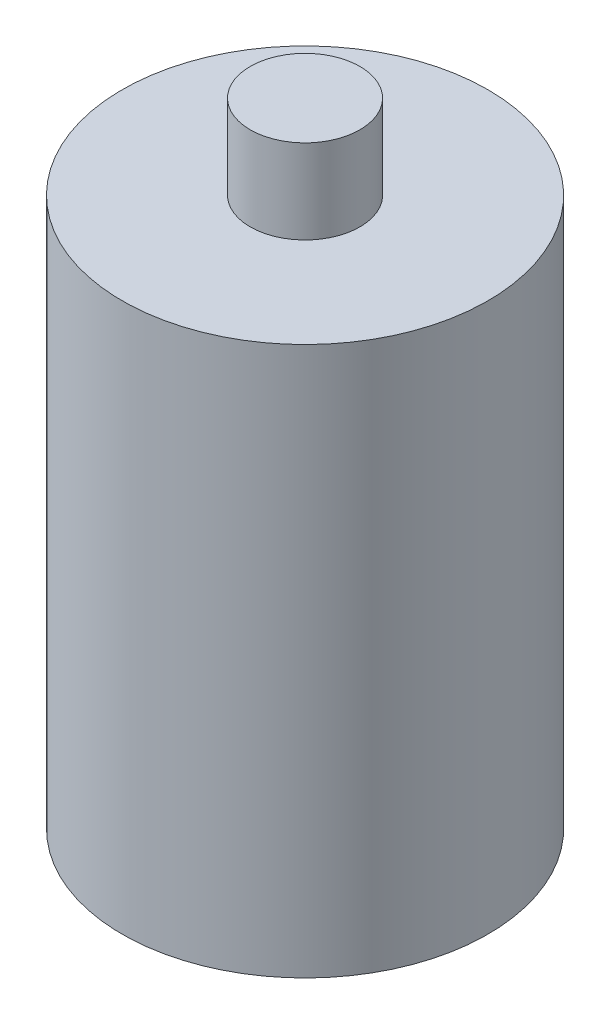
ISO-10303-21;
HEADER;
FILE_DESCRIPTION(('STEP AP214'),'2;1');
FILE_NAME('part.step','',(''),(''),'','','');
FILE_SCHEMA(('AUTOMOTIVE_DESIGN { 1 0 10303 214 1 1 1 1 }'));
ENDSEC;
DATA;
#1=APPLICATION_CONTEXT('core data for automotive mechanical design processes');
#2=APPLICATION_PROTOCOL_DEFINITION('international standard','automotive_design',2000,#1);
#3=PRODUCT_CONTEXT('',#1,'mechanical');
#4=PRODUCT('Part','Part','',(#3));
#5=PRODUCT_RELATED_PRODUCT_CATEGORY('part','',(#4));
#6=PRODUCT_DEFINITION_FORMATION('','',#4);
#7=PRODUCT_DEFINITION_CONTEXT('part definition',#1,'design');
#8=PRODUCT_DEFINITION('design','',#6,#7);
#9=PRODUCT_DEFINITION_SHAPE('','',#8);
#10=(LENGTH_UNIT() NAMED_UNIT(*) SI_UNIT(.MILLI.,.METRE.));
#11=(NAMED_UNIT(*) PLANE_ANGLE_UNIT() SI_UNIT($,.RADIAN.));
#12=(NAMED_UNIT(*) SI_UNIT($,.STERADIAN.) SOLID_ANGLE_UNIT());
#13=UNCERTAINTY_MEASURE_WITH_UNIT(LENGTH_MEASURE(1.E-05),#10,'distance_accuracy_value','');
#14=(GEOMETRIC_REPRESENTATION_CONTEXT(3) GLOBAL_UNCERTAINTY_ASSIGNED_CONTEXT((#13)) GLOBAL_UNIT_ASSIGNED_CONTEXT((#10,
#11,#12)) REPRESENTATION_CONTEXT('',''));
#15=CARTESIAN_POINT('',(0.,0.,0.));
#16=DIRECTION('',(0.,0.,1.));
#17=DIRECTION('',(1.,0.,0.));
#18=AXIS2_PLACEMENT_3D('',#15,#16,#17);
#19=CARTESIAN_POINT('',(0.,38.1,0.));
#20=DIRECTION('',(0.,1.,0.));
#21=DIRECTION('',(0.,0.,1.));
#22=AXIS2_PLACEMENT_3D('',#19,#20,#21);
#23=PLANE('',#22);
#24=CARTESIAN_POINT('',(0.,38.1,0.));
#25=DIRECTION('',(0.,1.,0.));
#26=DIRECTION('',(0.,0.,1.));
#27=AXIS2_PLACEMENT_3D('',#24,#25,#26);
#28=CIRCLE('',#27,12.7);
#29=CARTESIAN_POINT('',(0.,38.1,-12.7));
#30=VERTEX_POINT('',#29);
#31=EDGE_CURVE('E10',#30,#30,#28,.T.);
#32=ORIENTED_EDGE('',*,*,#31,.T.);
#33=EDGE_LOOP('',(#32));
#34=FACE_BOUND('',#33,.T.);
#35=CARTESIAN_POINT('',(0.,38.1,0.));
#36=DIRECTION('',(0.,1.,0.));
#37=DIRECTION('',(0.,0.,1.));
#38=AXIS2_PLACEMENT_3D('',#35,#36,#37);
#39=CIRCLE('',#38,3.81);
#40=CARTESIAN_POINT('',(0.,38.1,3.81));
#41=VERTEX_POINT('',#40);
#42=EDGE_CURVE('E44',#41,#41,#39,.T.);
#43=ORIENTED_EDGE('',*,*,#42,.F.);
#44=EDGE_LOOP('',(#43));
#45=FACE_BOUND('',#44,.T.);
#46=ADVANCED_FACE('F31',(#34,#45),#23,.T.);
#47=CARTESIAN_POINT('',(0.,38.1,0.));
#48=DIRECTION('',(0.,-1.,0.));
#49=DIRECTION('',(0.,0.,-1.));
#50=AXIS2_PLACEMENT_3D('',#47,#48,#49);
#51=CYLINDRICAL_SURFACE('',#50,12.7);
#52=CARTESIAN_POINT('',(0.,0.,0.));
#53=DIRECTION('',(0.,1.,0.));
#54=DIRECTION('',(0.,0.,1.));
#55=AXIS2_PLACEMENT_3D('',#52,#53,#54);
#56=CIRCLE('',#55,12.7);
#57=CARTESIAN_POINT('',(0.,0.,-12.7));
#58=VERTEX_POINT('',#57);
#59=EDGE_CURVE('E35',#58,#58,#56,.T.);
#60=CARTESIAN_POINT('',(0.,38.1,-12.7));
#61=CARTESIAN_POINT('',(0.,37.703125,-12.7));
#62=CARTESIAN_POINT('',(0.,37.30625,-12.7));
#63=CARTESIAN_POINT('',(0.,36.5125,-12.7));
#64=CARTESIAN_POINT('',(0.,36.115625,-12.7));
#65=CARTESIAN_POINT('',(0.,35.321875,-12.7));
#66=CARTESIAN_POINT('',(0.,34.925,-12.7));
#67=CARTESIAN_POINT('',(0.,34.13125,-12.7));
#68=CARTESIAN_POINT('',(0.,33.734375,-12.7));
#69=CARTESIAN_POINT('',(0.,32.940625,-12.7));
#70=CARTESIAN_POINT('',(0.,32.54375,-12.7));
#71=CARTESIAN_POINT('',(0.,31.75,-12.7));
#72=CARTESIAN_POINT('',(0.,31.353125,-12.7));
#73=CARTESIAN_POINT('',(0.,30.559375,-12.7));
#74=CARTESIAN_POINT('',(0.,30.1625,-12.7));
#75=CARTESIAN_POINT('',(0.,29.36875,-12.7));
#76=CARTESIAN_POINT('',(0.,28.971875,-12.7));
#77=CARTESIAN_POINT('',(0.,28.178125,-12.7));
#78=CARTESIAN_POINT('',(0.,27.78125,-12.7));
#79=CARTESIAN_POINT('',(0.,26.9875,-12.7));
#80=CARTESIAN_POINT('',(0.,26.590625,-12.7));
#81=CARTESIAN_POINT('',(0.,25.796875,-12.7));
#82=CARTESIAN_POINT('',(0.,25.4,-12.7));
#83=CARTESIAN_POINT('',(0.,24.60625,-12.7));
#84=CARTESIAN_POINT('',(0.,24.209375,-12.7));
#85=CARTESIAN_POINT('',(0.,23.415625,-12.7));
#86=CARTESIAN_POINT('',(0.,23.01875,-12.7));
#87=CARTESIAN_POINT('',(0.,22.225,-12.7));
#88=CARTESIAN_POINT('',(0.,21.828125,-12.7));
#89=CARTESIAN_POINT('',(0.,21.034375,-12.7));
#90=CARTESIAN_POINT('',(0.,20.6375,-12.7));
#91=CARTESIAN_POINT('',(0.,19.84375,-12.7));
#92=CARTESIAN_POINT('',(0.,19.446875,-12.7));
#93=CARTESIAN_POINT('',(0.,18.653125,-12.7));
#94=CARTESIAN_POINT('',(0.,18.25625,-12.7));
#95=CARTESIAN_POINT('',(0.,17.4625,-12.7));
#96=CARTESIAN_POINT('',(0.,17.065625,-12.7));
#97=CARTESIAN_POINT('',(0.,16.271875,-12.7));
#98=CARTESIAN_POINT('',(0.,15.875,-12.7));
#99=CARTESIAN_POINT('',(0.,15.08125,-12.7));
#100=CARTESIAN_POINT('',(0.,14.684375,-12.7));
#101=CARTESIAN_POINT('',(0.,13.890625,-12.7));
#102=CARTESIAN_POINT('',(0.,13.49375,-12.7));
#103=CARTESIAN_POINT('',(0.,12.7,-12.7));
#104=CARTESIAN_POINT('',(0.,12.303125,-12.7));
#105=CARTESIAN_POINT('',(0.,11.509375,-12.7));
#106=CARTESIAN_POINT('',(0.,11.1125,-12.7));
#107=CARTESIAN_POINT('',(0.,10.31875,-12.7));
#108=CARTESIAN_POINT('',(0.,9.92187499999999,-12.7));
#109=CARTESIAN_POINT('',(0.,9.128125,-12.7));
#110=CARTESIAN_POINT('',(0.,8.73124999999999,-12.7));
#111=CARTESIAN_POINT('',(0.,7.93749999999999,-12.7));
#112=CARTESIAN_POINT('',(0.,7.54062499999999,-12.7));
#113=CARTESIAN_POINT('',(0.,6.746875,-12.7));
#114=CARTESIAN_POINT('',(0.,6.35,-12.7));
#115=CARTESIAN_POINT('',(0.,5.55625,-12.7));
#116=CARTESIAN_POINT('',(0.,5.159375,-12.7));
#117=CARTESIAN_POINT('',(0.,4.365625,-12.7));
#118=CARTESIAN_POINT('',(0.,3.96875,-12.7));
#119=CARTESIAN_POINT('',(0.,3.175,-12.7));
#120=CARTESIAN_POINT('',(0.,2.778125,-12.7));
#121=CARTESIAN_POINT('',(0.,1.984375,-12.7));
#122=CARTESIAN_POINT('',(0.,1.5875,-12.7));
#123=CARTESIAN_POINT('',(0.,0.79375,-12.7));
#124=CARTESIAN_POINT('',(0.,0.396875,-12.7));
#125=CARTESIAN_POINT('',(0.,0.,-12.7));
#126=B_SPLINE_CURVE_WITH_KNOTS('',3,(#60,#61,#62,#63,#64,#65,#66,#67,#68,#69,#70,#71,#72,#73,
#74,#75,#76,#77,#78,#79,#80,#81,#82,#83,#84,#85,#86,#87,#88,#89,#90,#91,#92,#93,#94,#95,#96,#97,
#98,#99,#100,#101,#102,#103,#104,#105,#106,#107,#108,#109,#110,#111,#112,#113,#114,#115,#116,
#117,#118,#119,#120,#121,#122,#123,#124,#125),.UNSPECIFIED.,.F.,.F.,(4,2,2,2,2,2,2,2,2,2,2,2,2,
2,2,2,2,2,2,2,2,2,2,2,2,2,2,2,2,2,2,2,4),(0.,1.190625,2.38125,3.571875,4.7625,5.953125,7.14375,
8.334375,9.52500000000001,10.715625,11.90625,13.096875,14.2875,15.478125,16.66875,17.859375,
19.05,20.240625,21.43125,22.621875,23.8125,25.003125,26.19375,27.384375,28.575,29.765625,
30.95625,32.146875,33.3375,34.528125,35.71875,36.909375,38.1),.UNSPECIFIED.);
#127=EDGE_CURVE('BSEAM33',#30,#58,#126,.T.);
#128=ORIENTED_EDGE('',*,*,#31,.F.);
#129=ORIENTED_EDGE('',*,*,#59,.T.);
#130=ORIENTED_EDGE('',*,*,#127,.T.);
#131=ORIENTED_EDGE('',*,*,#127,.F.);
#132=EDGE_LOOP('',(#128,#130,#129,#131));
#133=FACE_BOUND('',#132,.T.);
#134=ADVANCED_FACE('F33',(#133),#51,.T.);
#135=CARTESIAN_POINT('',(0.,0.,0.));
#136=DIRECTION('',(0.,1.,0.));
#137=DIRECTION('',(0.,0.,1.));
#138=AXIS2_PLACEMENT_3D('',#135,#136,#137);
#139=PLANE('',#138);
#140=ORIENTED_EDGE('',*,*,#59,.F.);
#141=EDGE_LOOP('',(#140));
#142=FACE_BOUND('',#141,.T.);
#143=ADVANCED_FACE('F55',(#142),#139,.F.);
#144=CARTESIAN_POINT('',(0.,43.942,0.));
#145=DIRECTION('',(0.,-1.,0.));
#146=DIRECTION('',(0.,0.,-1.));
#147=AXIS2_PLACEMENT_3D('',#144,#145,#146);
#148=CYLINDRICAL_SURFACE('',#147,3.81);
#149=CARTESIAN_POINT('',(0.,43.942,0.));
#150=DIRECTION('',(0.,1.,0.));
#151=DIRECTION('',(0.,0.,1.));
#152=AXIS2_PLACEMENT_3D('',#149,#150,#151);
#153=CIRCLE('',#152,3.81);
#154=CARTESIAN_POINT('',(0.,43.942,3.81));
#155=VERTEX_POINT('',#154);
#156=EDGE_CURVE('E42',#155,#155,#153,.T.);
#157=ORIENTED_EDGE('',*,*,#156,.F.);
#158=EDGE_LOOP('',(#157));
#159=FACE_BOUND('',#158,.T.);
#160=ORIENTED_EDGE('',*,*,#42,.T.);
#161=EDGE_LOOP('',(#160));
#162=FACE_BOUND('',#161,.T.);
#163=ADVANCED_FACE('F52',(#159,#162),#148,.T.);
#164=CARTESIAN_POINT('',(0.,43.942,0.));
#165=DIRECTION('',(0.,1.,0.));
#166=DIRECTION('',(0.,0.,1.));
#167=AXIS2_PLACEMENT_3D('',#164,#165,#166);
#168=PLANE('',#167);
#169=ORIENTED_EDGE('',*,*,#156,.T.);
#170=EDGE_LOOP('',(#169));
#171=FACE_BOUND('',#170,.T.);
#172=ADVANCED_FACE('F50',(#171),#168,.T.);
#173=CLOSED_SHELL('',(#46,#134,#143,#163,#172));
#174=MANIFOLD_SOLID_BREP('B2',#173);
#175=ADVANCED_BREP_SHAPE_REPRESENTATION('',(#18,#174),#14);
#176=SHAPE_DEFINITION_REPRESENTATION(#9,#175);
ENDSEC;
END-ISO-10303-21;
